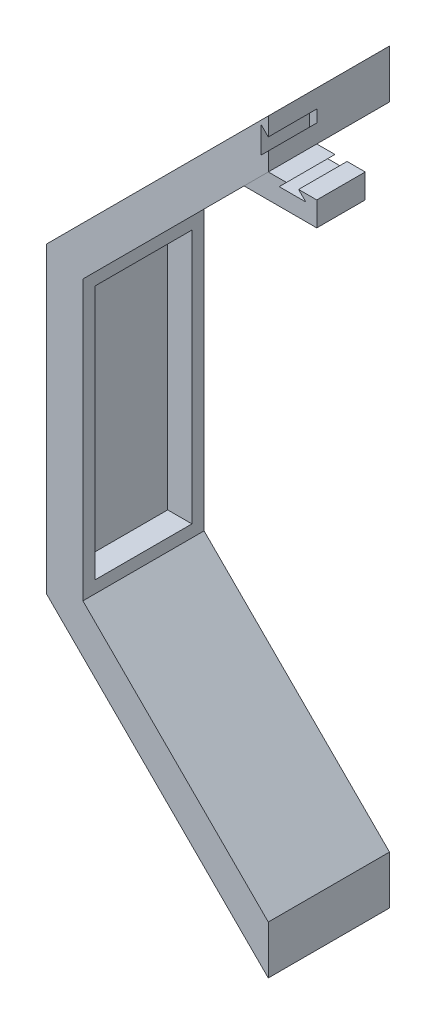
ISO-10303-21;
HEADER;
FILE_DESCRIPTION(('STEP AP214'),'2;1');
FILE_NAME('part.step','',(''),(''),'','','');
FILE_SCHEMA(('AUTOMOTIVE_DESIGN { 1 0 10303 214 1 1 1 1 }'));
ENDSEC;
DATA;
#1=APPLICATION_CONTEXT('core data for automotive mechanical design processes');
#2=APPLICATION_PROTOCOL_DEFINITION('international standard','automotive_design',2000,#1);
#3=PRODUCT_CONTEXT('',#1,'mechanical');
#4=PRODUCT('Part','Part','',(#3));
#5=PRODUCT_RELATED_PRODUCT_CATEGORY('part','',(#4));
#6=PRODUCT_DEFINITION_FORMATION('','',#4);
#7=PRODUCT_DEFINITION_CONTEXT('part definition',#1,'design');
#8=PRODUCT_DEFINITION('design','',#6,#7);
#9=PRODUCT_DEFINITION_SHAPE('','',#8);
#10=(LENGTH_UNIT() NAMED_UNIT(*) SI_UNIT(.MILLI.,.METRE.));
#11=(NAMED_UNIT(*) PLANE_ANGLE_UNIT() SI_UNIT($,.RADIAN.));
#12=(NAMED_UNIT(*) SI_UNIT($,.STERADIAN.) SOLID_ANGLE_UNIT());
#13=UNCERTAINTY_MEASURE_WITH_UNIT(LENGTH_MEASURE(1.E-05),#10,'distance_accuracy_value','');
#14=(GEOMETRIC_REPRESENTATION_CONTEXT(3) GLOBAL_UNCERTAINTY_ASSIGNED_CONTEXT((#13)) GLOBAL_UNIT_ASSIGNED_CONTEXT((#10,
#11,#12)) REPRESENTATION_CONTEXT('',''));
#15=CARTESIAN_POINT('',(0.,0.,0.));
#16=DIRECTION('',(0.,0.,1.));
#17=DIRECTION('',(1.,0.,0.));
#18=AXIS2_PLACEMENT_3D('',#15,#16,#17);
#19=CARTESIAN_POINT('',(81.5,124.,30.));
#20=DIRECTION('',(-0.707106781186541,0.707106781186554,0.));
#21=DIRECTION('',(-0.707106781186554,-0.707106781186541,0.));
#22=AXIS2_PLACEMENT_3D('',#19,#20,#21);
#23=PLANE('',#22);
#24=DIRECTION('',(-0.707106781186554,-0.707106781186541,0.));
#25=VECTOR('',#24,1.);
#26=CARTESIAN_POINT('',(81.5,124.,50.));
#27=LINE('',#26,#25);
#28=CARTESIAN_POINT('',(91.5000000000002,134.,50.));
#29=VERTEX_POINT('',#28);
#30=CARTESIAN_POINT('',(81.5,124.,50.));
#31=VERTEX_POINT('',#30);
#32=EDGE_CURVE('E139',#29,#31,#27,.T.);
#33=ORIENTED_EDGE('',*,*,#32,.F.);
#34=DIRECTION('',(0.,0.,1.));
#35=VECTOR('',#34,1.);
#36=CARTESIAN_POINT('',(91.5000000000002,134.,30.));
#37=LINE('',#36,#35);
#38=CARTESIAN_POINT('',(91.5000000000002,134.,30.));
#39=VERTEX_POINT('',#38);
#40=EDGE_CURVE('E12',#39,#29,#37,.T.);
#41=ORIENTED_EDGE('',*,*,#40,.F.);
#42=DIRECTION('',(-0.707106781186554,-0.707106781186541,0.));
#43=VECTOR('',#42,1.);
#44=CARTESIAN_POINT('',(81.5,124.,30.));
#45=LINE('',#44,#43);
#46=CARTESIAN_POINT('',(81.5,124.,30.));
#47=VERTEX_POINT('',#46);
#48=EDGE_CURVE('E159',#39,#47,#45,.T.);
#49=ORIENTED_EDGE('',*,*,#48,.T.);
#50=DIRECTION('',(0.,0.,1.));
#51=VECTOR('',#50,1.);
#52=CARTESIAN_POINT('',(81.5,124.,30.));
#53=LINE('',#52,#51);
#54=EDGE_CURVE('E45',#47,#31,#53,.T.);
#55=ORIENTED_EDGE('',*,*,#54,.T.);
#56=EDGE_LOOP('',(#33,#41,#49,#55));
#57=FACE_BOUND('',#56,.T.);
#58=ADVANCED_FACE('F42',(#57),#23,.T.);
#59=CARTESIAN_POINT('',(91.5000000000002,134.,30.));
#60=DIRECTION('',(0.,1.,0.));
#61=DIRECTION('',(0.,0.,1.));
#62=AXIS2_PLACEMENT_3D('',#59,#60,#61);
#63=PLANE('',#62);
#64=DIRECTION('',(-1.,0.,0.));
#65=VECTOR('',#64,1.);
#66=CARTESIAN_POINT('',(91.5000000000002,134.,50.));
#67=LINE('',#66,#65);
#68=CARTESIAN_POINT('',(99.0000000000002,134.,50.));
#69=VERTEX_POINT('',#68);
#70=EDGE_CURVE('E157',#69,#29,#67,.T.);
#71=ORIENTED_EDGE('',*,*,#70,.F.);
#72=DIRECTION('',(0.,0.,1.));
#73=VECTOR('',#72,1.);
#74=CARTESIAN_POINT('',(99.0000000000002,134.,30.));
#75=LINE('',#74,#73);
#76=CARTESIAN_POINT('',(99.0000000000002,134.,30.));
#77=VERTEX_POINT('',#76);
#78=EDGE_CURVE('E51',#77,#69,#75,.T.);
#79=ORIENTED_EDGE('',*,*,#78,.F.);
#80=DIRECTION('',(-1.,0.,0.));
#81=VECTOR('',#80,1.);
#82=CARTESIAN_POINT('',(91.5000000000002,134.,30.));
#83=LINE('',#82,#81);
#84=EDGE_CURVE('E129',#77,#39,#83,.T.);
#85=ORIENTED_EDGE('',*,*,#84,.T.);
#86=ORIENTED_EDGE('',*,*,#40,.T.);
#87=EDGE_LOOP('',(#71,#79,#85,#86));
#88=FACE_BOUND('',#87,.T.);
#89=ADVANCED_FACE('F171',(#88),#63,.T.);
#90=CARTESIAN_POINT('',(99.0000000000002,134.,30.));
#91=DIRECTION('',(0.707106781186548,-0.707106781186548,0.));
#92=DIRECTION('',(0.707106781186548,0.707106781186548,0.));
#93=AXIS2_PLACEMENT_3D('',#90,#91,#92);
#94=PLANE('',#93);
#95=DIRECTION('',(0.707106781186547,0.707106781186547,0.));
#96=VECTOR('',#95,1.);
#97=CARTESIAN_POINT('',(99.0000000000002,134.,50.));
#98=LINE('',#97,#96);
#99=CARTESIAN_POINT('',(96.0000000000002,131.,50.));
#100=VERTEX_POINT('',#99);
#101=EDGE_CURVE('E116',#100,#69,#98,.T.);
#102=ORIENTED_EDGE('',*,*,#101,.F.);
#103=DIRECTION('',(0.,0.,1.));
#104=VECTOR('',#103,1.);
#105=CARTESIAN_POINT('',(96.0000000000002,131.,30.));
#106=LINE('',#105,#104);
#107=CARTESIAN_POINT('',(96.0000000000002,131.,30.));
#108=VERTEX_POINT('',#107);
#109=EDGE_CURVE('E111',#108,#100,#106,.T.);
#110=ORIENTED_EDGE('',*,*,#109,.F.);
#111=DIRECTION('',(0.707106781186547,0.707106781186547,0.));
#112=VECTOR('',#111,1.);
#113=CARTESIAN_POINT('',(99.0000000000002,134.,30.));
#114=LINE('',#113,#112);
#115=EDGE_CURVE('E114',#108,#77,#114,.T.);
#116=ORIENTED_EDGE('',*,*,#115,.T.);
#117=ORIENTED_EDGE('',*,*,#78,.T.);
#118=EDGE_LOOP('',(#102,#110,#116,#117));
#119=FACE_BOUND('',#118,.T.);
#120=ADVANCED_FACE('F113',(#119),#94,.T.);
#121=CARTESIAN_POINT('',(96.0000000000002,131.,30.));
#122=DIRECTION('',(0.,1.,0.));
#123=DIRECTION('',(0.,0.,1.));
#124=AXIS2_PLACEMENT_3D('',#121,#122,#123);
#125=PLANE('',#124);
#126=DIRECTION('',(-1.,0.,0.));
#127=VECTOR('',#126,1.);
#128=CARTESIAN_POINT('',(96.0000000000002,131.,50.));
#129=LINE('',#128,#127);
#130=CARTESIAN_POINT('',(107.,131.,50.));
#131=VERTEX_POINT('',#130);
#132=EDGE_CURVE('E154',#131,#100,#129,.T.);
#133=ORIENTED_EDGE('',*,*,#132,.F.);
#134=DIRECTION('',(0.,0.,1.));
#135=VECTOR('',#134,1.);
#136=CARTESIAN_POINT('',(107.,131.,30.));
#137=LINE('',#136,#135);
#138=CARTESIAN_POINT('',(107.,131.,30.));
#139=VERTEX_POINT('',#138);
#140=EDGE_CURVE('E121',#139,#131,#137,.T.);
#141=ORIENTED_EDGE('',*,*,#140,.F.);
#142=DIRECTION('',(-1.,0.,0.));
#143=VECTOR('',#142,1.);
#144=CARTESIAN_POINT('',(96.0000000000002,131.,30.));
#145=LINE('',#144,#143);
#146=EDGE_CURVE('E127',#139,#108,#145,.T.);
#147=ORIENTED_EDGE('',*,*,#146,.T.);
#148=ORIENTED_EDGE('',*,*,#109,.T.);
#149=EDGE_LOOP('',(#133,#141,#147,#148));
#150=FACE_BOUND('',#149,.T.);
#151=ADVANCED_FACE('F131',(#150),#125,.T.);
#152=CARTESIAN_POINT('',(107.,131.,30.));
#153=DIRECTION('',(-0.707106781186548,-0.707106781186548,0.));
#154=DIRECTION('',(0.707106781186548,-0.707106781186548,0.));
#155=AXIS2_PLACEMENT_3D('',#152,#153,#154);
#156=PLANE('',#155);
#157=DIRECTION('',(0.707106781186547,-0.707106781186547,0.));
#158=VECTOR('',#157,1.);
#159=CARTESIAN_POINT('',(107.,131.,50.));
#160=LINE('',#159,#158);
#161=CARTESIAN_POINT('',(104.,134.,50.));
#162=VERTEX_POINT('',#161);
#163=EDGE_CURVE('E151',#162,#131,#160,.T.);
#164=ORIENTED_EDGE('',*,*,#163,.F.);
#165=DIRECTION('',(0.,0.,1.));
#166=VECTOR('',#165,1.);
#167=CARTESIAN_POINT('',(104.,134.,30.));
#168=LINE('',#167,#166);
#169=CARTESIAN_POINT('',(104.,134.,30.));
#170=VERTEX_POINT('',#169);
#171=EDGE_CURVE('E163',#170,#162,#168,.T.);
#172=ORIENTED_EDGE('',*,*,#171,.F.);
#173=DIRECTION('',(0.707106781186547,-0.707106781186547,0.));
#174=VECTOR('',#173,1.);
#175=CARTESIAN_POINT('',(107.,131.,30.));
#176=LINE('',#175,#174);
#177=EDGE_CURVE('E132',#170,#139,#176,.T.);
#178=ORIENTED_EDGE('',*,*,#177,.T.);
#179=ORIENTED_EDGE('',*,*,#140,.T.);
#180=EDGE_LOOP('',(#164,#172,#178,#179));
#181=FACE_BOUND('',#180,.T.);
#182=ADVANCED_FACE('F184',(#181),#156,.T.);
#183=CARTESIAN_POINT('',(104.,134.,30.));
#184=DIRECTION('',(0.,1.,0.));
#185=DIRECTION('',(0.,0.,1.));
#186=AXIS2_PLACEMENT_3D('',#183,#184,#185);
#187=PLANE('',#186);
#188=DIRECTION('',(-1.,0.,0.));
#189=VECTOR('',#188,1.);
#190=CARTESIAN_POINT('',(104.,134.,50.));
#191=LINE('',#190,#189);
#192=CARTESIAN_POINT('',(111.5,134.,50.));
#193=VERTEX_POINT('',#192);
#194=EDGE_CURVE('E148',#193,#162,#191,.T.);
#195=ORIENTED_EDGE('',*,*,#194,.F.);
#196=DIRECTION('',(0.,0.,1.));
#197=VECTOR('',#196,1.);
#198=CARTESIAN_POINT('',(111.5,134.,30.));
#199=LINE('',#198,#197);
#200=CARTESIAN_POINT('',(111.5,134.,30.));
#201=VERTEX_POINT('',#200);
#202=EDGE_CURVE('E165',#201,#193,#199,.T.);
#203=ORIENTED_EDGE('',*,*,#202,.F.);
#204=DIRECTION('',(-1.,0.,0.));
#205=VECTOR('',#204,1.);
#206=CARTESIAN_POINT('',(104.,134.,30.));
#207=LINE('',#206,#205);
#208=EDGE_CURVE('E134',#201,#170,#207,.T.);
#209=ORIENTED_EDGE('',*,*,#208,.T.);
#210=ORIENTED_EDGE('',*,*,#171,.T.);
#211=EDGE_LOOP('',(#195,#203,#209,#210));
#212=FACE_BOUND('',#211,.T.);
#213=ADVANCED_FACE('F187',(#212),#187,.T.);
#214=CARTESIAN_POINT('',(111.5,134.,30.));
#215=DIRECTION('',(1.,0.,0.));
#216=DIRECTION('',(0.,0.,-1.));
#217=AXIS2_PLACEMENT_3D('',#214,#215,#216);
#218=PLANE('',#217);
#219=DIRECTION('',(0.,1.,0.));
#220=VECTOR('',#219,1.);
#221=CARTESIAN_POINT('',(111.5,134.,50.));
#222=LINE('',#221,#220);
#223=CARTESIAN_POINT('',(111.5,124.,50.));
#224=VERTEX_POINT('',#223);
#225=EDGE_CURVE('E145',#224,#193,#222,.T.);
#226=ORIENTED_EDGE('',*,*,#225,.F.);
#227=DIRECTION('',(0.,0.,1.));
#228=VECTOR('',#227,1.);
#229=CARTESIAN_POINT('',(111.5,124.,30.));
#230=LINE('',#229,#228);
#231=CARTESIAN_POINT('',(111.5,124.,30.));
#232=VERTEX_POINT('',#231);
#233=EDGE_CURVE('E166',#232,#224,#230,.T.);
#234=ORIENTED_EDGE('',*,*,#233,.F.);
#235=DIRECTION('',(0.,1.,0.));
#236=VECTOR('',#235,1.);
#237=CARTESIAN_POINT('',(111.5,134.,30.));
#238=LINE('',#237,#236);
#239=EDGE_CURVE('E262',#232,#201,#238,.T.);
#240=ORIENTED_EDGE('',*,*,#239,.T.);
#241=ORIENTED_EDGE('',*,*,#202,.T.);
#242=EDGE_LOOP('',(#226,#234,#240,#241));
#243=FACE_BOUND('',#242,.T.);
#244=ADVANCED_FACE('F191',(#243),#218,.T.);
#245=CARTESIAN_POINT('',(111.5,124.,30.));
#246=DIRECTION('',(0.,-1.,0.));
#247=DIRECTION('',(1.,0.,0.));
#248=AXIS2_PLACEMENT_3D('',#245,#246,#247);
#249=PLANE('',#248);
#250=DIRECTION('',(1.,0.,0.));
#251=VECTOR('',#250,1.);
#252=CARTESIAN_POINT('',(111.5,124.,50.));
#253=LINE('',#252,#251);
#254=EDGE_CURVE('E142',#31,#224,#253,.T.);
#255=ORIENTED_EDGE('',*,*,#254,.F.);
#256=ORIENTED_EDGE('',*,*,#54,.F.);
#257=DIRECTION('',(1.,0.,0.));
#258=VECTOR('',#257,1.);
#259=CARTESIAN_POINT('',(111.5,124.,30.));
#260=LINE('',#259,#258);
#261=EDGE_CURVE('E263',#47,#232,#260,.T.);
#262=ORIENTED_EDGE('',*,*,#261,.T.);
#263=ORIENTED_EDGE('',*,*,#233,.T.);
#264=EDGE_LOOP('',(#255,#256,#262,#263));
#265=FACE_BOUND('',#264,.T.);
#266=ADVANCED_FACE('F168',(#265),#249,.T.);
#267=CARTESIAN_POINT('',(0.,0.,30.));
#268=DIRECTION('',(0.,0.,1.));
#269=DIRECTION('',(1.,0.,0.));
#270=AXIS2_PLACEMENT_3D('',#267,#268,#269);
#271=PLANE('',#270);
#272=ORIENTED_EDGE('',*,*,#48,.F.);
#273=ORIENTED_EDGE('',*,*,#84,.F.);
#274=ORIENTED_EDGE('',*,*,#115,.F.);
#275=ORIENTED_EDGE('',*,*,#146,.F.);
#276=ORIENTED_EDGE('',*,*,#177,.F.);
#277=ORIENTED_EDGE('',*,*,#208,.F.);
#278=ORIENTED_EDGE('',*,*,#239,.F.);
#279=ORIENTED_EDGE('',*,*,#261,.F.);
#280=EDGE_LOOP('',(#272,#273,#274,#275,#276,#277,#278,#279));
#281=FACE_BOUND('',#280,.T.);
#282=ADVANCED_FACE('F125',(#281),#271,.F.);
#283=CARTESIAN_POINT('',(0.,0.,50.));
#284=DIRECTION('',(0.,0.,1.));
#285=DIRECTION('',(1.,0.,0.));
#286=AXIS2_PLACEMENT_3D('',#283,#284,#285);
#287=PLANE('',#286);
#288=ORIENTED_EDGE('',*,*,#32,.T.);
#289=ORIENTED_EDGE('',*,*,#254,.T.);
#290=ORIENTED_EDGE('',*,*,#225,.T.);
#291=ORIENTED_EDGE('',*,*,#194,.T.);
#292=ORIENTED_EDGE('',*,*,#163,.T.);
#293=ORIENTED_EDGE('',*,*,#132,.T.);
#294=ORIENTED_EDGE('',*,*,#101,.T.);
#295=ORIENTED_EDGE('',*,*,#70,.T.);
#296=EDGE_LOOP('',(#288,#289,#290,#291,#292,#293,#294,#295));
#297=FACE_BOUND('',#296,.T.);
#298=ADVANCED_FACE('F170',(#297),#287,.T.);
#299=CLOSED_SHELL('',(#58,#89,#120,#151,#182,#213,#244,#266,#282,#298));
#300=MANIFOLD_SOLID_BREP('B2',#299);
#301=CARTESIAN_POINT('',(0.,62.5,50.));
#302=DIRECTION('',(0.707106781186547,-0.707106781186548,0.));
#303=DIRECTION('',(0.707106781186548,0.707106781186547,0.));
#304=AXIS2_PLACEMENT_3D('',#301,#302,#303);
#305=PLANE('',#304);
#306=DIRECTION('',(-0.707106781186548,-0.707106781186546,0.));
#307=VECTOR('',#306,1.);
#308=CARTESIAN_POINT('',(0.,62.5,0.));
#309=LINE('',#308,#307);
#310=CARTESIAN_POINT('',(91.5000000000003,154.,0.));
#311=VERTEX_POINT('',#310);
#312=CARTESIAN_POINT('',(0.,62.5,0.));
#313=VERTEX_POINT('',#312);
#314=EDGE_CURVE('E514',#311,#313,#309,.T.);
#315=ORIENTED_EDGE('',*,*,#314,.T.);
#316=DIRECTION('',(0.,0.,-1.));
#317=VECTOR('',#316,1.);
#318=CARTESIAN_POINT('',(0.,62.5,50.));
#319=LINE('',#318,#317);
#320=CARTESIAN_POINT('',(0.,62.5,50.));
#321=VERTEX_POINT('',#320);
#322=EDGE_CURVE('E40',#321,#313,#319,.T.);
#323=ORIENTED_EDGE('',*,*,#322,.F.);
#324=DIRECTION('',(-0.707106781186548,-0.707106781186546,0.));
#325=VECTOR('',#324,1.);
#326=CARTESIAN_POINT('',(0.,62.5,50.));
#327=LINE('',#326,#325);
#328=CARTESIAN_POINT('',(91.5000000000003,154.,50.));
#329=VERTEX_POINT('',#328);
#330=EDGE_CURVE('E525',#329,#321,#327,.T.);
#331=ORIENTED_EDGE('',*,*,#330,.F.);
#332=DIRECTION('',(0.,0.,-1.));
#333=VECTOR('',#332,1.);
#334=CARTESIAN_POINT('',(91.5000000000003,154.,50.));
#335=LINE('',#334,#333);
#336=EDGE_CURVE('E544',#329,#311,#335,.T.);
#337=ORIENTED_EDGE('',*,*,#336,.T.);
#338=EDGE_LOOP('',(#315,#323,#331,#337));
#339=FACE_BOUND('',#338,.T.);
#340=ADVANCED_FACE('F269',(#339),#305,.F.);
#341=CARTESIAN_POINT('',(0.,-62.5,50.));
#342=DIRECTION('',(1.,0.,0.));
#343=DIRECTION('',(0.,1.,0.));
#344=AXIS2_PLACEMENT_3D('',#341,#342,#343);
#345=PLANE('',#344);
#346=DIRECTION('',(0.,-1.,0.));
#347=VECTOR('',#346,1.);
#348=CARTESIAN_POINT('',(0.,-62.5,0.));
#349=LINE('',#348,#347);
#350=CARTESIAN_POINT('',(0.,-62.5,0.));
#351=VERTEX_POINT('',#350);
#352=EDGE_CURVE('E547',#313,#351,#349,.T.);
#353=ORIENTED_EDGE('',*,*,#352,.T.);
#354=DIRECTION('',(0.,0.,-1.));
#355=VECTOR('',#354,1.);
#356=CARTESIAN_POINT('',(0.,-62.5,50.));
#357=LINE('',#356,#355);
#358=CARTESIAN_POINT('',(0.,-62.5,50.));
#359=VERTEX_POINT('',#358);
#360=EDGE_CURVE('E276',#359,#351,#357,.T.);
#361=ORIENTED_EDGE('',*,*,#360,.F.);
#362=DIRECTION('',(0.,-1.,0.));
#363=VECTOR('',#362,1.);
#364=CARTESIAN_POINT('',(0.,-62.5,50.));
#365=LINE('',#364,#363);
#366=EDGE_CURVE('E528',#321,#359,#365,.T.);
#367=ORIENTED_EDGE('',*,*,#366,.F.);
#368=ORIENTED_EDGE('',*,*,#322,.T.);
#369=EDGE_LOOP('',(#353,#361,#367,#368));
#370=FACE_BOUND('',#369,.T.);
#371=ADVANCED_FACE('F606',(#370),#345,.F.);
#372=CARTESIAN_POINT('',(91.5000000000003,-154.,50.));
#373=DIRECTION('',(0.707106781186546,0.707106781186549,0.));
#374=DIRECTION('',(-0.707106781186549,0.707106781186546,0.));
#375=AXIS2_PLACEMENT_3D('',#372,#373,#374);
#376=PLANE('',#375);
#377=DIRECTION('',(0.707106781186549,-0.707106781186546,0.));
#378=VECTOR('',#377,1.);
#379=CARTESIAN_POINT('',(91.5000000000003,-154.,0.));
#380=LINE('',#379,#378);
#381=CARTESIAN_POINT('',(91.5000000000003,-154.,0.));
#382=VERTEX_POINT('',#381);
#383=EDGE_CURVE('E549',#351,#382,#380,.T.);
#384=ORIENTED_EDGE('',*,*,#383,.T.);
#385=DIRECTION('',(0.,0.,-1.));
#386=VECTOR('',#385,1.);
#387=CARTESIAN_POINT('',(91.5000000000003,-154.,50.));
#388=LINE('',#387,#386);
#389=CARTESIAN_POINT('',(91.5000000000003,-154.,50.));
#390=VERTEX_POINT('',#389);
#391=EDGE_CURVE('E576',#390,#382,#388,.T.);
#392=ORIENTED_EDGE('',*,*,#391,.F.);
#393=DIRECTION('',(0.707106781186549,-0.707106781186546,0.));
#394=VECTOR('',#393,1.);
#395=CARTESIAN_POINT('',(91.5000000000003,-154.,50.));
#396=LINE('',#395,#394);
#397=EDGE_CURVE('E531',#359,#390,#396,.T.);
#398=ORIENTED_EDGE('',*,*,#397,.F.);
#399=ORIENTED_EDGE('',*,*,#360,.T.);
#400=EDGE_LOOP('',(#384,#392,#398,#399));
#401=FACE_BOUND('',#400,.T.);
#402=ADVANCED_FACE('F583',(#401),#376,.F.);
#403=CARTESIAN_POINT('',(91.5000000000003,-134.,50.));
#404=DIRECTION('',(-1.,0.,0.));
#405=DIRECTION('',(0.,0.,1.));
#406=AXIS2_PLACEMENT_3D('',#403,#404,#405);
#407=PLANE('',#406);
#408=DIRECTION('',(0.,1.,0.));
#409=VECTOR('',#408,1.);
#410=CARTESIAN_POINT('',(91.5000000000003,-134.,0.));
#411=LINE('',#410,#409);
#412=CARTESIAN_POINT('',(91.5000000000003,-134.,0.));
#413=VERTEX_POINT('',#412);
#414=EDGE_CURVE('E551',#382,#413,#411,.T.);
#415=ORIENTED_EDGE('',*,*,#414,.T.);
#416=DIRECTION('',(0.,0.,-1.));
#417=VECTOR('',#416,1.);
#418=CARTESIAN_POINT('',(91.5000000000003,-134.,50.));
#419=LINE('',#418,#417);
#420=CARTESIAN_POINT('',(91.5000000000003,-134.,50.));
#421=VERTEX_POINT('',#420);
#422=EDGE_CURVE('E573',#421,#413,#419,.T.);
#423=ORIENTED_EDGE('',*,*,#422,.F.);
#424=DIRECTION('',(0.,1.,0.));
#425=VECTOR('',#424,1.);
#426=CARTESIAN_POINT('',(91.5000000000003,-134.,50.));
#427=LINE('',#426,#425);
#428=EDGE_CURVE('E533',#390,#421,#427,.T.);
#429=ORIENTED_EDGE('',*,*,#428,.F.);
#430=ORIENTED_EDGE('',*,*,#391,.T.);
#431=EDGE_LOOP('',(#415,#423,#429,#430));
#432=FACE_BOUND('',#431,.T.);
#433=ADVANCED_FACE('F594',(#432),#407,.F.);
#434=CARTESIAN_POINT('',(15.,-57.4999999999997,50.));
#435=DIRECTION('',(-0.707106781186547,-0.707106781186548,0.));
#436=DIRECTION('',(0.707106781186548,-0.707106781186547,0.));
#437=AXIS2_PLACEMENT_3D('',#434,#435,#436);
#438=PLANE('',#437);
#439=DIRECTION('',(-0.707106781186548,0.707106781186547,0.));
#440=VECTOR('',#439,1.);
#441=CARTESIAN_POINT('',(15.,-57.4999999999997,0.));
#442=LINE('',#441,#440);
#443=CARTESIAN_POINT('',(15.,-57.4999999999997,0.));
#444=VERTEX_POINT('',#443);
#445=EDGE_CURVE('E553',#413,#444,#442,.T.);
#446=ORIENTED_EDGE('',*,*,#445,.T.);
#447=DIRECTION('',(0.,0.,-1.));
#448=VECTOR('',#447,1.);
#449=CARTESIAN_POINT('',(15.,-57.4999999999997,50.));
#450=LINE('',#449,#448);
#451=CARTESIAN_POINT('',(15.,-57.4999999999997,50.));
#452=VERTEX_POINT('',#451);
#453=EDGE_CURVE('E570',#452,#444,#450,.T.);
#454=ORIENTED_EDGE('',*,*,#453,.F.);
#455=DIRECTION('',(-0.707106781186548,0.707106781186547,0.));
#456=VECTOR('',#455,1.);
#457=CARTESIAN_POINT('',(15.,-57.4999999999997,50.));
#458=LINE('',#457,#456);
#459=EDGE_CURVE('E535',#421,#452,#458,.T.);
#460=ORIENTED_EDGE('',*,*,#459,.F.);
#461=ORIENTED_EDGE('',*,*,#422,.T.);
#462=EDGE_LOOP('',(#446,#454,#460,#461));
#463=FACE_BOUND('',#462,.T.);
#464=ADVANCED_FACE('F598',(#463),#438,.F.);
#465=CARTESIAN_POINT('',(15.,57.5,50.));
#466=DIRECTION('',(-1.,0.,0.));
#467=DIRECTION('',(0.,0.,1.));
#468=AXIS2_PLACEMENT_3D('',#465,#466,#467);
#469=PLANE('',#468);
#470=DIRECTION('',(0.,0.,1.));
#471=VECTOR('',#470,1.);
#472=CARTESIAN_POINT('',(15.,52.5,5.));
#473=LINE('',#472,#471);
#474=CARTESIAN_POINT('',(15.,52.5,5.));
#475=VERTEX_POINT('',#474);
#476=CARTESIAN_POINT('',(15.,52.5,45.));
#477=VERTEX_POINT('',#476);
#478=EDGE_CURVE('E460',#475,#477,#473,.T.);
#479=ORIENTED_EDGE('',*,*,#478,.F.);
#480=DIRECTION('',(0.,1.,0.));
#481=VECTOR('',#480,1.);
#482=CARTESIAN_POINT('',(15.,52.5,5.));
#483=LINE('',#482,#481);
#484=CARTESIAN_POINT('',(15.,-52.4999999999997,4.99999999999999));
#485=VERTEX_POINT('',#484);
#486=EDGE_CURVE('E291',#485,#475,#483,.T.);
#487=ORIENTED_EDGE('',*,*,#486,.F.);
#488=DIRECTION('',(0.,0.,-1.));
#489=VECTOR('',#488,1.);
#490=CARTESIAN_POINT('',(15.,-52.4999999999997,4.99999999999999));
#491=LINE('',#490,#489);
#492=CARTESIAN_POINT('',(15.,-52.4999999999997,45.));
#493=VERTEX_POINT('',#492);
#494=EDGE_CURVE('E449',#493,#485,#491,.T.);
#495=ORIENTED_EDGE('',*,*,#494,.F.);
#496=DIRECTION('',(0.,-1.,0.));
#497=VECTOR('',#496,1.);
#498=CARTESIAN_POINT('',(15.,52.5,45.));
#499=LINE('',#498,#497);
#500=EDGE_CURVE('E464',#477,#493,#499,.T.);
#501=ORIENTED_EDGE('',*,*,#500,.F.);
#502=EDGE_LOOP('',(#479,#487,#495,#501));
#503=FACE_BOUND('',#502,.T.);
#504=DIRECTION('',(0.,1.,0.));
#505=VECTOR('',#504,1.);
#506=CARTESIAN_POINT('',(15.,57.5,0.));
#507=LINE('',#506,#505);
#508=CARTESIAN_POINT('',(15.,57.5,0.));
#509=VERTEX_POINT('',#508);
#510=EDGE_CURVE('E555',#444,#509,#507,.T.);
#511=ORIENTED_EDGE('',*,*,#510,.T.);
#512=DIRECTION('',(0.,0.,-1.));
#513=VECTOR('',#512,1.);
#514=CARTESIAN_POINT('',(15.,57.5,50.));
#515=LINE('',#514,#513);
#516=CARTESIAN_POINT('',(15.,57.5,5.));
#517=VERTEX_POINT('',#516);
#518=EDGE_CURVE('E566',#517,#509,#515,.T.);
#519=ORIENTED_EDGE('',*,*,#518,.F.);
#520=DIRECTION('',(0.,0.,-1.));
#521=VECTOR('',#520,1.);
#522=CARTESIAN_POINT('',(15.,57.5,5.));
#523=LINE('',#522,#521);
#524=CARTESIAN_POINT('',(15.,57.5,45.));
#525=VERTEX_POINT('',#524);
#526=EDGE_CURVE('E481',#525,#517,#523,.T.);
#527=ORIENTED_EDGE('',*,*,#526,.F.);
#528=CARTESIAN_POINT('',(15.,57.5,50.));
#529=VERTEX_POINT('',#528);
#530=EDGE_CURVE('E567',#529,#525,#515,.T.);
#531=ORIENTED_EDGE('',*,*,#530,.F.);
#532=DIRECTION('',(0.,1.,0.));
#533=VECTOR('',#532,1.);
#534=CARTESIAN_POINT('',(15.,57.5,50.));
#535=LINE('',#534,#533);
#536=EDGE_CURVE('E537',#452,#529,#535,.T.);
#537=ORIENTED_EDGE('',*,*,#536,.F.);
#538=ORIENTED_EDGE('',*,*,#453,.T.);
#539=EDGE_LOOP('',(#511,#519,#527,#531,#537,#538));
#540=FACE_BOUND('',#539,.T.);
#541=ADVANCED_FACE('F620',(#503,#540),#469,.F.);
#542=CARTESIAN_POINT('',(91.5000000000002,134.,50.));
#543=DIRECTION('',(-0.707106781186547,0.707106781186548,0.));
#544=DIRECTION('',(-0.707106781186548,-0.707106781186547,0.));
#545=AXIS2_PLACEMENT_3D('',#542,#543,#544);
#546=PLANE('',#545);
#547=DIRECTION('',(0.,0.,1.));
#548=VECTOR('',#547,1.);
#549=CARTESIAN_POINT('',(87.9644660940674,130.464466094067,30.));
#550=LINE('',#549,#548);
#551=CARTESIAN_POINT('',(87.9644660940675,130.464466094067,5.));
#552=VERTEX_POINT('',#551);
#553=CARTESIAN_POINT('',(87.9644660940674,130.464466094067,30.));
#554=VERTEX_POINT('',#553);
#555=EDGE_CURVE('E498',#552,#554,#550,.T.);
#556=ORIENTED_EDGE('',*,*,#555,.F.);
#557=DIRECTION('',(0.707106781186548,0.707106781186547,0.));
#558=VECTOR('',#557,1.);
#559=CARTESIAN_POINT('',(15.,57.5,5.));
#560=LINE('',#559,#558);
#561=EDGE_CURVE('E471',#517,#552,#560,.T.);
#562=ORIENTED_EDGE('',*,*,#561,.F.);
#563=ORIENTED_EDGE('',*,*,#518,.T.);
#564=DIRECTION('',(0.707106781186548,0.707106781186547,0.));
#565=VECTOR('',#564,1.);
#566=CARTESIAN_POINT('',(91.5000000000002,134.,0.));
#567=LINE('',#566,#565);
#568=CARTESIAN_POINT('',(91.5000000000002,134.,0.));
#569=VERTEX_POINT('',#568);
#570=EDGE_CURVE('E558',#509,#569,#567,.T.);
#571=ORIENTED_EDGE('',*,*,#570,.T.);
#572=DIRECTION('',(0.,0.,-1.));
#573=VECTOR('',#572,1.);
#574=CARTESIAN_POINT('',(91.5000000000002,134.,50.));
#575=LINE('',#574,#573);
#576=CARTESIAN_POINT('',(91.5000000000002,134.,50.));
#577=VERTEX_POINT('',#576);
#578=EDGE_CURVE('E563',#577,#569,#575,.T.);
#579=ORIENTED_EDGE('',*,*,#578,.F.);
#580=DIRECTION('',(0.707106781186548,0.707106781186547,0.));
#581=VECTOR('',#580,1.);
#582=CARTESIAN_POINT('',(91.5000000000002,134.,50.));
#583=LINE('',#582,#581);
#584=EDGE_CURVE('E539',#529,#577,#583,.T.);
#585=ORIENTED_EDGE('',*,*,#584,.F.);
#586=ORIENTED_EDGE('',*,*,#530,.T.);
#587=DIRECTION('',(-0.707106781186548,-0.707106781186547,0.));
#588=VECTOR('',#587,1.);
#589=CARTESIAN_POINT('',(15.,57.5,45.));
#590=LINE('',#589,#588);
#591=CARTESIAN_POINT('',(81.5000000000001,124.,45.));
#592=VERTEX_POINT('',#591);
#593=EDGE_CURVE('E507',#592,#525,#590,.T.);
#594=ORIENTED_EDGE('',*,*,#593,.F.);
#595=DIRECTION('',(0.,0.,1.));
#596=VECTOR('',#595,1.);
#597=CARTESIAN_POINT('',(81.5000000000001,124.,45.));
#598=LINE('',#597,#596);
#599=CARTESIAN_POINT('',(81.5000000000001,124.,30.));
#600=VERTEX_POINT('',#599);
#601=EDGE_CURVE('E504',#600,#592,#598,.T.);
#602=ORIENTED_EDGE('',*,*,#601,.F.);
#603=DIRECTION('',(-0.707106781186548,-0.707106781186548,0.));
#604=VECTOR('',#603,1.);
#605=CARTESIAN_POINT('',(81.5000000000001,124.,30.));
#606=LINE('',#605,#604);
#607=EDGE_CURVE('E501',#554,#600,#606,.T.);
#608=ORIENTED_EDGE('',*,*,#607,.F.);
#609=EDGE_LOOP('',(#556,#562,#563,#571,#579,#585,#586,#594,#602,#608));
#610=FACE_BOUND('',#609,.T.);
#611=ADVANCED_FACE('F615',(#610),#546,.F.);
#612=CARTESIAN_POINT('',(91.5000000000003,154.,50.));
#613=DIRECTION('',(-1.,0.,0.));
#614=DIRECTION('',(0.,-1.,0.));
#615=AXIS2_PLACEMENT_3D('',#612,#613,#614);
#616=PLANE('',#615);
#617=DIRECTION('',(0.,1.,0.));
#618=VECTOR('',#617,1.);
#619=CARTESIAN_POINT('',(91.5000000000002,141.5,30.));
#620=LINE('',#619,#618);
#621=CARTESIAN_POINT('',(91.5000000000002,141.5,30.));
#622=VERTEX_POINT('',#621);
#623=CARTESIAN_POINT('',(91.5000000000002,146.5,30.));
#624=VERTEX_POINT('',#623);
#625=EDGE_CURVE('E424',#622,#624,#620,.T.);
#626=ORIENTED_EDGE('',*,*,#625,.F.);
#627=DIRECTION('',(0.,0.,1.));
#628=VECTOR('',#627,1.);
#629=CARTESIAN_POINT('',(91.5000000000002,141.5,30.));
#630=LINE('',#629,#628);
#631=CARTESIAN_POINT('',(91.5000000000002,141.5,50.));
#632=VERTEX_POINT('',#631);
#633=EDGE_CURVE('E461',#622,#632,#630,.T.);
#634=ORIENTED_EDGE('',*,*,#633,.T.);
#635=DIRECTION('',(0.,1.,0.));
#636=VECTOR('',#635,1.);
#637=CARTESIAN_POINT('',(91.5000000000003,154.,50.));
#638=LINE('',#637,#636);
#639=EDGE_CURVE('E541',#577,#632,#638,.T.);
#640=ORIENTED_EDGE('',*,*,#639,.F.);
#641=ORIENTED_EDGE('',*,*,#578,.T.);
#642=DIRECTION('',(0.,1.,0.));
#643=VECTOR('',#642,1.);
#644=CARTESIAN_POINT('',(91.5000000000003,154.,0.));
#645=LINE('',#644,#643);
#646=EDGE_CURVE('E529',#569,#311,#645,.T.);
#647=ORIENTED_EDGE('',*,*,#646,.T.);
#648=ORIENTED_EDGE('',*,*,#336,.F.);
#649=CARTESIAN_POINT('',(91.5000000000002,146.5,50.));
#650=VERTEX_POINT('',#649);
#651=EDGE_CURVE('E438',#650,#329,#638,.T.);
#652=ORIENTED_EDGE('',*,*,#651,.F.);
#653=DIRECTION('',(0.,0.,1.));
#654=VECTOR('',#653,1.);
#655=CARTESIAN_POINT('',(91.5000000000002,146.5,30.));
#656=LINE('',#655,#654);
#657=EDGE_CURVE('E283',#624,#650,#656,.T.);
#658=ORIENTED_EDGE('',*,*,#657,.F.);
#659=EDGE_LOOP('',(#626,#634,#640,#641,#647,#648,#652,#658));
#660=FACE_BOUND('',#659,.T.);
#661=ADVANCED_FACE('F436',(#660),#616,.F.);
#662=CARTESIAN_POINT('',(0.,0.,50.));
#663=DIRECTION('',(0.,0.,-1.));
#664=DIRECTION('',(-1.,0.,0.));
#665=AXIS2_PLACEMENT_3D('',#662,#663,#664);
#666=PLANE('',#665);
#667=ORIENTED_EDGE('',*,*,#639,.T.);
#668=DIRECTION('',(0.707106781186547,0.707106781186547,0.));
#669=VECTOR('',#668,1.);
#670=CARTESIAN_POINT('',(88.5000000000002,138.5,50.));
#671=LINE('',#670,#669);
#672=CARTESIAN_POINT('',(88.5000000000002,138.5,50.));
#673=VERTEX_POINT('',#672);
#674=EDGE_CURVE('E433',#673,#632,#671,.T.);
#675=ORIENTED_EDGE('',*,*,#674,.F.);
#676=DIRECTION('',(0.,-1.,0.));
#677=VECTOR('',#676,1.);
#678=CARTESIAN_POINT('',(88.5000000000002,149.5,50.));
#679=LINE('',#678,#677);
#680=CARTESIAN_POINT('',(88.5000000000002,149.5,50.));
#681=VERTEX_POINT('',#680);
#682=EDGE_CURVE('E819',#681,#673,#679,.T.);
#683=ORIENTED_EDGE('',*,*,#682,.F.);
#684=DIRECTION('',(-0.707106781186547,0.707106781186547,0.));
#685=VECTOR('',#684,1.);
#686=CARTESIAN_POINT('',(91.5000000000002,146.5,50.));
#687=LINE('',#686,#685);
#688=EDGE_CURVE('E821',#650,#681,#687,.T.);
#689=ORIENTED_EDGE('',*,*,#688,.F.);
#690=ORIENTED_EDGE('',*,*,#651,.T.);
#691=ORIENTED_EDGE('',*,*,#330,.T.);
#692=ORIENTED_EDGE('',*,*,#366,.T.);
#693=ORIENTED_EDGE('',*,*,#397,.T.);
#694=ORIENTED_EDGE('',*,*,#428,.T.);
#695=ORIENTED_EDGE('',*,*,#459,.T.);
#696=ORIENTED_EDGE('',*,*,#536,.T.);
#697=ORIENTED_EDGE('',*,*,#584,.T.);
#698=EDGE_LOOP('',(#667,#675,#683,#689,#690,#691,#692,#693,#694,#695,#696,#697));
#699=FACE_BOUND('',#698,.T.);
#700=ADVANCED_FACE('F602',(#699),#666,.F.);
#701=CARTESIAN_POINT('',(0.,0.,0.));
#702=DIRECTION('',(0.,0.,-1.));
#703=DIRECTION('',(-1.,0.,0.));
#704=AXIS2_PLACEMENT_3D('',#701,#702,#703);
#705=PLANE('',#704);
#706=ORIENTED_EDGE('',*,*,#314,.F.);
#707=ORIENTED_EDGE('',*,*,#646,.F.);
#708=ORIENTED_EDGE('',*,*,#570,.F.);
#709=ORIENTED_EDGE('',*,*,#510,.F.);
#710=ORIENTED_EDGE('',*,*,#445,.F.);
#711=ORIENTED_EDGE('',*,*,#414,.F.);
#712=ORIENTED_EDGE('',*,*,#383,.F.);
#713=ORIENTED_EDGE('',*,*,#352,.F.);
#714=EDGE_LOOP('',(#706,#707,#708,#709,#710,#711,#712,#713));
#715=FACE_BOUND('',#714,.T.);
#716=ADVANCED_FACE('F589',(#715),#705,.T.);
#717=CARTESIAN_POINT('',(7.92893218813453,64.5710678118655,5.));
#718=DIRECTION('',(0.,0.,-1.));
#719=DIRECTION('',(-1.,0.,0.));
#720=AXIS2_PLACEMENT_3D('',#717,#718,#719);
#721=PLANE('',#720);
#722=ORIENTED_EDGE('',*,*,#561,.T.);
#723=DIRECTION('',(0.707106781186547,-0.707106781186548,0.));
#724=VECTOR('',#723,1.);
#725=CARTESIAN_POINT('',(80.893398282202,137.535533905933,5.));
#726=LINE('',#725,#724);
#727=CARTESIAN_POINT('',(80.893398282202,137.535533905933,5.));
#728=VERTEX_POINT('',#727);
#729=EDGE_CURVE('E496',#728,#552,#726,.T.);
#730=ORIENTED_EDGE('',*,*,#729,.F.);
#731=DIRECTION('',(0.707106781186548,0.707106781186547,0.));
#732=VECTOR('',#731,1.);
#733=CARTESIAN_POINT('',(7.92893218813453,64.5710678118655,5.));
#734=LINE('',#733,#732);
#735=CARTESIAN_POINT('',(7.92893218813453,64.5710678118655,5.));
#736=VERTEX_POINT('',#735);
#737=EDGE_CURVE('E477',#736,#728,#734,.T.);
#738=ORIENTED_EDGE('',*,*,#737,.F.);
#739=DIRECTION('',(0.707106781186547,-0.707106781186548,0.));
#740=VECTOR('',#739,1.);
#741=CARTESIAN_POINT('',(7.92893218813453,64.5710678118655,5.));
#742=LINE('',#741,#740);
#743=EDGE_CURVE('E512',#736,#517,#742,.T.);
#744=ORIENTED_EDGE('',*,*,#743,.T.);
#745=EDGE_LOOP('',(#722,#730,#738,#744));
#746=FACE_BOUND('',#745,.T.);
#747=ADVANCED_FACE('F638',(#746),#721,.F.);
#748=CARTESIAN_POINT('',(7.92893218813453,64.5710678118655,5.));
#749=DIRECTION('',(-0.707106781186548,-0.707106781186547,0.));
#750=DIRECTION('',(0.707106781186547,-0.707106781186548,0.));
#751=AXIS2_PLACEMENT_3D('',#748,#749,#750);
#752=PLANE('',#751);
#753=ORIENTED_EDGE('',*,*,#526,.T.);
#754=ORIENTED_EDGE('',*,*,#743,.F.);
#755=DIRECTION('',(0.,0.,-1.));
#756=VECTOR('',#755,1.);
#757=CARTESIAN_POINT('',(7.92893218813453,64.5710678118655,5.));
#758=LINE('',#757,#756);
#759=CARTESIAN_POINT('',(7.92893218813452,64.5710678118655,45.));
#760=VERTEX_POINT('',#759);
#761=EDGE_CURVE('E493',#760,#736,#758,.T.);
#762=ORIENTED_EDGE('',*,*,#761,.F.);
#763=DIRECTION('',(0.707106781186547,-0.707106781186548,0.));
#764=VECTOR('',#763,1.);
#765=CARTESIAN_POINT('',(7.92893218813452,64.5710678118655,45.));
#766=LINE('',#765,#764);
#767=EDGE_CURVE('E515',#760,#525,#766,.T.);
#768=ORIENTED_EDGE('',*,*,#767,.T.);
#769=EDGE_LOOP('',(#753,#754,#762,#768));
#770=FACE_BOUND('',#769,.T.);
#771=ADVANCED_FACE('F641',(#770),#752,.F.);
#772=CARTESIAN_POINT('',(7.92893218813452,64.5710678118655,45.));
#773=DIRECTION('',(0.,0.,1.));
#774=DIRECTION('',(1.,0.,0.));
#775=AXIS2_PLACEMENT_3D('',#772,#773,#774);
#776=PLANE('',#775);
#777=ORIENTED_EDGE('',*,*,#593,.T.);
#778=ORIENTED_EDGE('',*,*,#767,.F.);
#779=DIRECTION('',(-0.707106781186548,-0.707106781186547,0.));
#780=VECTOR('',#779,1.);
#781=CARTESIAN_POINT('',(7.92893218813452,64.5710678118655,45.));
#782=LINE('',#781,#780);
#783=CARTESIAN_POINT('',(74.4289321881346,131.071067811865,45.));
#784=VERTEX_POINT('',#783);
#785=EDGE_CURVE('E490',#784,#760,#782,.T.);
#786=ORIENTED_EDGE('',*,*,#785,.F.);
#787=DIRECTION('',(0.707106781186547,-0.707106781186548,0.));
#788=VECTOR('',#787,1.);
#789=CARTESIAN_POINT('',(74.4289321881346,131.071067811865,45.));
#790=LINE('',#789,#788);
#791=EDGE_CURVE('E517',#784,#592,#790,.T.);
#792=ORIENTED_EDGE('',*,*,#791,.T.);
#793=EDGE_LOOP('',(#777,#778,#786,#792));
#794=FACE_BOUND('',#793,.T.);
#795=ADVANCED_FACE('F625',(#794),#776,.F.);
#796=CARTESIAN_POINT('',(74.4289321881346,131.071067811865,45.));
#797=DIRECTION('',(0.707106781186548,0.707106781186547,0.));
#798=DIRECTION('',(-0.707106781186547,0.707106781186548,0.));
#799=AXIS2_PLACEMENT_3D('',#796,#797,#798);
#800=PLANE('',#799);
#801=ORIENTED_EDGE('',*,*,#601,.T.);
#802=ORIENTED_EDGE('',*,*,#791,.F.);
#803=DIRECTION('',(0.,0.,1.));
#804=VECTOR('',#803,1.);
#805=CARTESIAN_POINT('',(74.4289321881346,131.071067811865,45.));
#806=LINE('',#805,#804);
#807=CARTESIAN_POINT('',(74.4289321881346,131.071067811865,30.));
#808=VERTEX_POINT('',#807);
#809=EDGE_CURVE('E487',#808,#784,#806,.T.);
#810=ORIENTED_EDGE('',*,*,#809,.F.);
#811=DIRECTION('',(0.707106781186547,-0.707106781186548,0.));
#812=VECTOR('',#811,1.);
#813=CARTESIAN_POINT('',(74.4289321881346,131.071067811865,30.));
#814=LINE('',#813,#812);
#815=EDGE_CURVE('E519',#808,#600,#814,.T.);
#816=ORIENTED_EDGE('',*,*,#815,.T.);
#817=EDGE_LOOP('',(#801,#802,#810,#816));
#818=FACE_BOUND('',#817,.T.);
#819=ADVANCED_FACE('F629',(#818),#800,.F.);
#820=CARTESIAN_POINT('',(74.4289321881346,131.071067811865,30.));
#821=DIRECTION('',(0.,0.,1.));
#822=DIRECTION('',(1.,0.,0.));
#823=AXIS2_PLACEMENT_3D('',#820,#821,#822);
#824=PLANE('',#823);
#825=ORIENTED_EDGE('',*,*,#607,.T.);
#826=ORIENTED_EDGE('',*,*,#815,.F.);
#827=DIRECTION('',(-0.707106781186548,-0.707106781186548,0.));
#828=VECTOR('',#827,1.);
#829=CARTESIAN_POINT('',(74.4289321881346,131.071067811865,30.));
#830=LINE('',#829,#828);
#831=CARTESIAN_POINT('',(80.893398282202,137.535533905933,30.));
#832=VERTEX_POINT('',#831);
#833=EDGE_CURVE('E484',#832,#808,#830,.T.);
#834=ORIENTED_EDGE('',*,*,#833,.F.);
#835=DIRECTION('',(0.707106781186547,-0.707106781186548,0.));
#836=VECTOR('',#835,1.);
#837=CARTESIAN_POINT('',(80.893398282202,137.535533905933,30.));
#838=LINE('',#837,#836);
#839=EDGE_CURVE('E521',#832,#554,#838,.T.);
#840=ORIENTED_EDGE('',*,*,#839,.T.);
#841=EDGE_LOOP('',(#825,#826,#834,#840));
#842=FACE_BOUND('',#841,.T.);
#843=ADVANCED_FACE('F632',(#842),#824,.F.);
#844=CARTESIAN_POINT('',(80.893398282202,137.535533905933,30.));
#845=DIRECTION('',(0.707106781186548,0.707106781186547,0.));
#846=DIRECTION('',(-0.707106781186547,0.707106781186548,0.));
#847=AXIS2_PLACEMENT_3D('',#844,#845,#846);
#848=PLANE('',#847);
#849=ORIENTED_EDGE('',*,*,#555,.T.);
#850=ORIENTED_EDGE('',*,*,#839,.F.);
#851=DIRECTION('',(0.,0.,1.));
#852=VECTOR('',#851,1.);
#853=CARTESIAN_POINT('',(80.893398282202,137.535533905933,30.));
#854=LINE('',#853,#852);
#855=EDGE_CURVE('E480',#728,#832,#854,.T.);
#856=ORIENTED_EDGE('',*,*,#855,.F.);
#857=ORIENTED_EDGE('',*,*,#729,.T.);
#858=EDGE_LOOP('',(#849,#850,#856,#857));
#859=FACE_BOUND('',#858,.T.);
#860=ADVANCED_FACE('F634',(#859),#848,.F.);
#861=CARTESIAN_POINT('',(-28.3210678118655,28.3210678118656,0.));
#862=DIRECTION('',(-0.707106781186547,0.707106781186548,0.));
#863=DIRECTION('',(-0.707106781186548,-0.707106781186547,0.));
#864=AXIS2_PLACEMENT_3D('',#861,#862,#863);
#865=PLANE('',#864);
#866=ORIENTED_EDGE('',*,*,#737,.T.);
#867=ORIENTED_EDGE('',*,*,#855,.T.);
#868=ORIENTED_EDGE('',*,*,#833,.T.);
#869=ORIENTED_EDGE('',*,*,#809,.T.);
#870=ORIENTED_EDGE('',*,*,#785,.T.);
#871=ORIENTED_EDGE('',*,*,#761,.T.);
#872=EDGE_LOOP('',(#866,#867,#868,#869,#870,#871));
#873=FACE_BOUND('',#872,.T.);
#874=ADVANCED_FACE('F643',(#873),#865,.F.);
#875=CARTESIAN_POINT('',(5.,52.5,5.));
#876=DIRECTION('',(0.,0.,-1.));
#877=DIRECTION('',(0.,1.,0.));
#878=AXIS2_PLACEMENT_3D('',#875,#876,#877);
#879=PLANE('',#878);
#880=ORIENTED_EDGE('',*,*,#486,.T.);
#881=DIRECTION('',(1.,0.,0.));
#882=VECTOR('',#881,1.);
#883=CARTESIAN_POINT('',(5.,52.5,5.));
#884=LINE('',#883,#882);
#885=CARTESIAN_POINT('',(5.,52.5,5.));
#886=VERTEX_POINT('',#885);
#887=EDGE_CURVE('E458',#886,#475,#884,.T.);
#888=ORIENTED_EDGE('',*,*,#887,.F.);
#889=DIRECTION('',(0.,1.,0.));
#890=VECTOR('',#889,1.);
#891=CARTESIAN_POINT('',(5.,52.5,5.));
#892=LINE('',#891,#890);
#893=CARTESIAN_POINT('',(5.,-52.4999999999997,4.99999999999999));
#894=VERTEX_POINT('',#893);
#895=EDGE_CURVE('E445',#894,#886,#892,.T.);
#896=ORIENTED_EDGE('',*,*,#895,.F.);
#897=DIRECTION('',(1.,0.,0.));
#898=VECTOR('',#897,1.);
#899=CARTESIAN_POINT('',(5.,-52.4999999999997,4.99999999999999));
#900=LINE('',#899,#898);
#901=EDGE_CURVE('E469',#894,#485,#900,.T.);
#902=ORIENTED_EDGE('',*,*,#901,.T.);
#903=EDGE_LOOP('',(#880,#888,#896,#902));
#904=FACE_BOUND('',#903,.T.);
#905=ADVANCED_FACE('F645',(#904),#879,.F.);
#906=CARTESIAN_POINT('',(5.,-52.4999999999997,4.99999999999999));
#907=DIRECTION('',(0.,-1.,0.));
#908=DIRECTION('',(0.,0.,-1.));
#909=AXIS2_PLACEMENT_3D('',#906,#907,#908);
#910=PLANE('',#909);
#911=ORIENTED_EDGE('',*,*,#494,.T.);
#912=ORIENTED_EDGE('',*,*,#901,.F.);
#913=DIRECTION('',(0.,0.,-1.));
#914=VECTOR('',#913,1.);
#915=CARTESIAN_POINT('',(5.,-52.4999999999997,4.99999999999999));
#916=LINE('',#915,#914);
#917=CARTESIAN_POINT('',(5.,-52.4999999999997,45.));
#918=VERTEX_POINT('',#917);
#919=EDGE_CURVE('E455',#918,#894,#916,.T.);
#920=ORIENTED_EDGE('',*,*,#919,.F.);
#921=DIRECTION('',(1.,0.,0.));
#922=VECTOR('',#921,1.);
#923=CARTESIAN_POINT('',(5.,-52.4999999999997,45.));
#924=LINE('',#923,#922);
#925=EDGE_CURVE('E472',#918,#493,#924,.T.);
#926=ORIENTED_EDGE('',*,*,#925,.T.);
#927=EDGE_LOOP('',(#911,#912,#920,#926));
#928=FACE_BOUND('',#927,.T.);
#929=ADVANCED_FACE('F651',(#928),#910,.F.);
#930=CARTESIAN_POINT('',(5.,52.5,45.));
#931=DIRECTION('',(0.,0.,1.));
#932=DIRECTION('',(0.,-1.,0.));
#933=AXIS2_PLACEMENT_3D('',#930,#931,#932);
#934=PLANE('',#933);
#935=ORIENTED_EDGE('',*,*,#500,.T.);
#936=ORIENTED_EDGE('',*,*,#925,.F.);
#937=DIRECTION('',(0.,-1.,0.));
#938=VECTOR('',#937,1.);
#939=CARTESIAN_POINT('',(5.,52.5,45.));
#940=LINE('',#939,#938);
#941=CARTESIAN_POINT('',(5.,52.5,45.));
#942=VERTEX_POINT('',#941);
#943=EDGE_CURVE('E452',#942,#918,#940,.T.);
#944=ORIENTED_EDGE('',*,*,#943,.F.);
#945=DIRECTION('',(1.,0.,0.));
#946=VECTOR('',#945,1.);
#947=CARTESIAN_POINT('',(5.,52.5,45.));
#948=LINE('',#947,#946);
#949=EDGE_CURVE('E474',#942,#477,#948,.T.);
#950=ORIENTED_EDGE('',*,*,#949,.T.);
#951=EDGE_LOOP('',(#935,#936,#944,#950));
#952=FACE_BOUND('',#951,.T.);
#953=ADVANCED_FACE('F734',(#952),#934,.F.);
#954=CARTESIAN_POINT('',(5.,52.5,5.));
#955=DIRECTION('',(0.,1.,0.));
#956=DIRECTION('',(0.,0.,1.));
#957=AXIS2_PLACEMENT_3D('',#954,#955,#956);
#958=PLANE('',#957);
#959=ORIENTED_EDGE('',*,*,#478,.T.);
#960=ORIENTED_EDGE('',*,*,#949,.F.);
#961=DIRECTION('',(0.,0.,1.));
#962=VECTOR('',#961,1.);
#963=CARTESIAN_POINT('',(5.,52.5,5.));
#964=LINE('',#963,#962);
#965=EDGE_CURVE('E448',#886,#942,#964,.T.);
#966=ORIENTED_EDGE('',*,*,#965,.F.);
#967=ORIENTED_EDGE('',*,*,#887,.T.);
#968=EDGE_LOOP('',(#959,#960,#966,#967));
#969=FACE_BOUND('',#968,.T.);
#970=ADVANCED_FACE('F744',(#969),#958,.F.);
#971=CARTESIAN_POINT('',(5.,0.,0.));
#972=DIRECTION('',(-1.,0.,0.));
#973=DIRECTION('',(0.,0.,1.));
#974=AXIS2_PLACEMENT_3D('',#971,#972,#973);
#975=PLANE('',#974);
#976=ORIENTED_EDGE('',*,*,#895,.T.);
#977=ORIENTED_EDGE('',*,*,#965,.T.);
#978=ORIENTED_EDGE('',*,*,#943,.T.);
#979=ORIENTED_EDGE('',*,*,#919,.T.);
#980=EDGE_LOOP('',(#976,#977,#978,#979));
#981=FACE_BOUND('',#980,.T.);
#982=ADVANCED_FACE('F754',(#981),#975,.F.);
#983=CARTESIAN_POINT('',(88.5000000000002,138.5,30.));
#984=DIRECTION('',(0.707106781186548,-0.707106781186548,0.));
#985=DIRECTION('',(0.707106781186548,0.707106781186548,0.));
#986=AXIS2_PLACEMENT_3D('',#983,#984,#985);
#987=PLANE('',#986);
#988=ORIENTED_EDGE('',*,*,#674,.T.);
#989=ORIENTED_EDGE('',*,*,#633,.F.);
#990=DIRECTION('',(0.707106781186547,0.707106781186547,0.));
#991=VECTOR('',#990,1.);
#992=CARTESIAN_POINT('',(88.5000000000002,138.5,30.));
#993=LINE('',#992,#991);
#994=CARTESIAN_POINT('',(88.5000000000002,138.5,30.));
#995=VERTEX_POINT('',#994);
#996=EDGE_CURVE('E430',#995,#622,#993,.T.);
#997=ORIENTED_EDGE('',*,*,#996,.F.);
#998=DIRECTION('',(0.,0.,1.));
#999=VECTOR('',#998,1.);
#1000=CARTESIAN_POINT('',(88.5000000000002,138.5,30.));
#1001=LINE('',#1000,#999);
#1002=EDGE_CURVE('E440',#995,#673,#1001,.T.);
#1003=ORIENTED_EDGE('',*,*,#1002,.T.);
#1004=EDGE_LOOP('',(#988,#989,#997,#1003));
#1005=FACE_BOUND('',#1004,.T.);
#1006=ADVANCED_FACE('F764',(#1005),#987,.F.);
#1007=CARTESIAN_POINT('',(88.5000000000002,149.5,30.));
#1008=DIRECTION('',(-1.,0.,0.));
#1009=DIRECTION('',(0.,0.,1.));
#1010=AXIS2_PLACEMENT_3D('',#1007,#1008,#1009);
#1011=PLANE('',#1010);
#1012=ORIENTED_EDGE('',*,*,#682,.T.);
#1013=ORIENTED_EDGE('',*,*,#1002,.F.);
#1014=DIRECTION('',(0.,-1.,0.));
#1015=VECTOR('',#1014,1.);
#1016=CARTESIAN_POINT('',(88.5000000000002,149.5,30.));
#1017=LINE('',#1016,#1015);
#1018=CARTESIAN_POINT('',(88.5000000000002,149.5,30.));
#1019=VERTEX_POINT('',#1018);
#1020=EDGE_CURVE('E423',#1019,#995,#1017,.T.);
#1021=ORIENTED_EDGE('',*,*,#1020,.F.);
#1022=DIRECTION('',(0.,0.,1.));
#1023=VECTOR('',#1022,1.);
#1024=CARTESIAN_POINT('',(88.5000000000002,149.5,30.));
#1025=LINE('',#1024,#1023);
#1026=EDGE_CURVE('E419',#1019,#681,#1025,.T.);
#1027=ORIENTED_EDGE('',*,*,#1026,.T.);
#1028=EDGE_LOOP('',(#1012,#1013,#1021,#1027));
#1029=FACE_BOUND('',#1028,.T.);
#1030=ADVANCED_FACE('F787',(#1029),#1011,.F.);
#1031=CARTESIAN_POINT('',(91.5000000000002,146.5,30.));
#1032=DIRECTION('',(0.707106781186548,0.707106781186548,0.));
#1033=DIRECTION('',(-0.707106781186548,0.707106781186548,0.));
#1034=AXIS2_PLACEMENT_3D('',#1031,#1032,#1033);
#1035=PLANE('',#1034);
#1036=ORIENTED_EDGE('',*,*,#688,.T.);
#1037=ORIENTED_EDGE('',*,*,#1026,.F.);
#1038=DIRECTION('',(-0.707106781186547,0.707106781186547,0.));
#1039=VECTOR('',#1038,1.);
#1040=CARTESIAN_POINT('',(91.5000000000002,146.5,30.));
#1041=LINE('',#1040,#1039);
#1042=EDGE_CURVE('E416',#624,#1019,#1041,.T.);
#1043=ORIENTED_EDGE('',*,*,#1042,.F.);
#1044=ORIENTED_EDGE('',*,*,#657,.T.);
#1045=EDGE_LOOP('',(#1036,#1037,#1043,#1044));
#1046=FACE_BOUND('',#1045,.T.);
#1047=ADVANCED_FACE('F418',(#1046),#1035,.F.);
#1048=CARTESIAN_POINT('',(0.,0.,30.));
#1049=DIRECTION('',(0.,0.,1.));
#1050=DIRECTION('',(1.,0.,0.));
#1051=AXIS2_PLACEMENT_3D('',#1048,#1049,#1050);
#1052=PLANE('',#1051);
#1053=ORIENTED_EDGE('',*,*,#625,.T.);
#1054=ORIENTED_EDGE('',*,*,#1042,.T.);
#1055=ORIENTED_EDGE('',*,*,#1020,.T.);
#1056=ORIENTED_EDGE('',*,*,#996,.T.);
#1057=EDGE_LOOP('',(#1053,#1054,#1055,#1056));
#1058=FACE_BOUND('',#1057,.T.);
#1059=ADVANCED_FACE('F428',(#1058),#1052,.T.);
#1060=CLOSED_SHELL('',(#340,#371,#402,#433,#464,#541,#611,#661,#700,#716,#747,#771,#795,#819,
#843,#860,#874,#905,#929,#953,#970,#982,#1006,#1030,#1047,#1059));
#1061=MANIFOLD_SOLID_BREP('B6',#1060);
#1062=ADVANCED_BREP_SHAPE_REPRESENTATION('',(#18,#300,#1061),#14);
#1063=SHAPE_DEFINITION_REPRESENTATION(#9,#1062);
ENDSEC;
END-ISO-10303-21;
